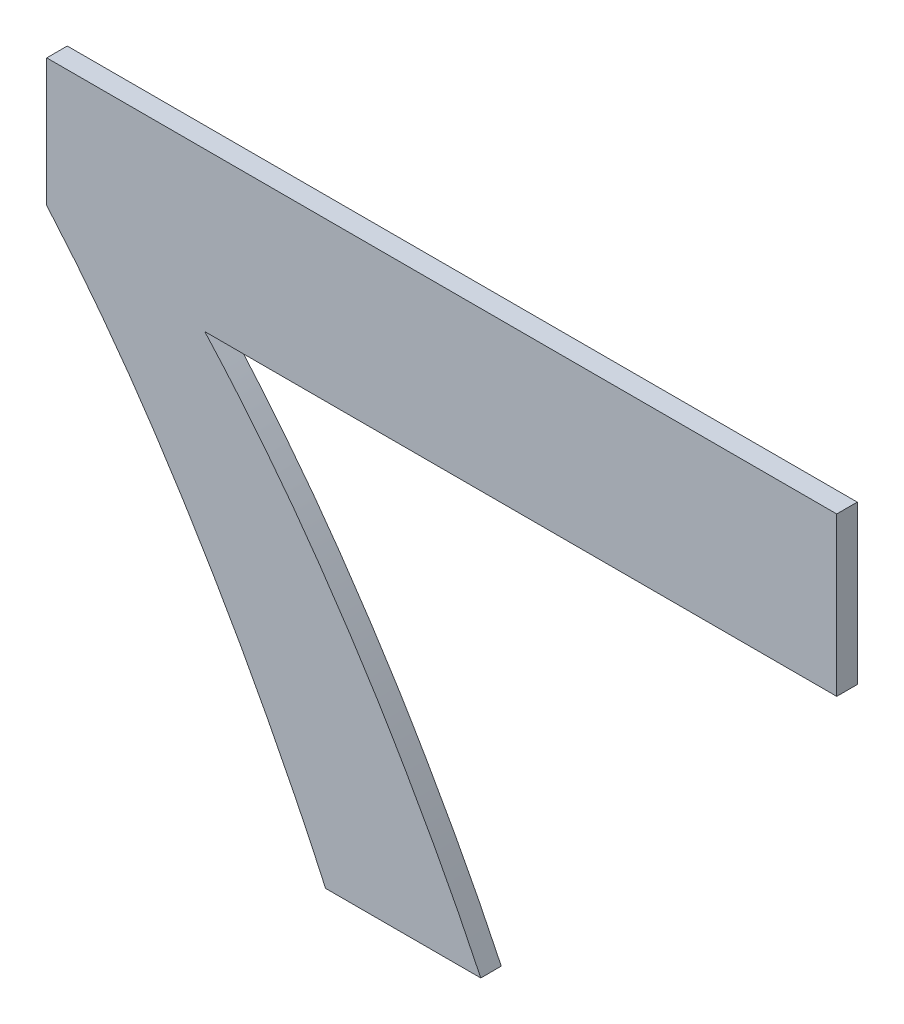
ISO-10303-21;
HEADER;
FILE_DESCRIPTION(('STEP AP214'),'2;1');
FILE_NAME('part.step','',(''),(''),'','','');
FILE_SCHEMA(('AUTOMOTIVE_DESIGN { 1 0 10303 214 1 1 1 1 }'));
ENDSEC;
DATA;
#1=APPLICATION_CONTEXT('core data for automotive mechanical design processes');
#2=APPLICATION_PROTOCOL_DEFINITION('international standard','automotive_design',2000,#1);
#3=PRODUCT_CONTEXT('',#1,'mechanical');
#4=PRODUCT('Part','Part','',(#3));
#5=PRODUCT_RELATED_PRODUCT_CATEGORY('part','',(#4));
#6=PRODUCT_DEFINITION_FORMATION('','',#4);
#7=PRODUCT_DEFINITION_CONTEXT('part definition',#1,'design');
#8=PRODUCT_DEFINITION('design','',#6,#7);
#9=PRODUCT_DEFINITION_SHAPE('','',#8);
#10=(LENGTH_UNIT() NAMED_UNIT(*) SI_UNIT(.MILLI.,.METRE.));
#11=(NAMED_UNIT(*) PLANE_ANGLE_UNIT() SI_UNIT($,.RADIAN.));
#12=(NAMED_UNIT(*) SI_UNIT($,.STERADIAN.) SOLID_ANGLE_UNIT());
#13=UNCERTAINTY_MEASURE_WITH_UNIT(LENGTH_MEASURE(1.E-05),#10,'distance_accuracy_value','');
#14=(GEOMETRIC_REPRESENTATION_CONTEXT(3) GLOBAL_UNCERTAINTY_ASSIGNED_CONTEXT((#13)) GLOBAL_UNIT_ASSIGNED_CONTEXT((#10,
#11,#12)) REPRESENTATION_CONTEXT('',''));
#15=CARTESIAN_POINT('',(0.,0.,0.));
#16=DIRECTION('',(0.,0.,1.));
#17=DIRECTION('',(1.,0.,0.));
#18=AXIS2_PLACEMENT_3D('',#15,#16,#17);
#19=CARTESIAN_POINT('',(-9.6153846153846,11.5024038461538,0.5));
#20=CARTESIAN_POINT('',(-9.3889882736424,11.2376522562014,0.5));
#21=CARTESIAN_POINT('',(-8.92608728055129,10.6963282534886,0.5));
#22=CARTESIAN_POINT('',(-8.25548066497366,9.83408603599883,0.5));
#23=CARTESIAN_POINT('',(-7.58138944532267,8.91609230107851,0.5));
#24=CARTESIAN_POINT('',(-6.9156621712902,7.93351961209931,0.5));
#25=CARTESIAN_POINT('',(-6.24835155024634,6.89353876319968,0.5));
#26=CARTESIAN_POINT('',(-5.5821432756538,5.79282828697568,0.5));
#27=CARTESIAN_POINT('',(-4.91431765251822,4.63406915861775,0.5));
#28=CARTESIAN_POINT('',(-4.03833035758797,3.01158053099116,0.5));
#29=CARTESIAN_POINT('',(-2.99323232642266,0.934386038558628,0.5));
#30=CARTESIAN_POINT('',(-1.90727624655536,-1.6250913851388,0.5));
#31=CARTESIAN_POINT('',(-0.943198230433538,-4.21007935595809,0.5));
#32=CARTESIAN_POINT('',(-0.430159665560484,-5.96811962402121,0.5));
#33=CARTESIAN_POINT('',(-0.174278846153829,-6.84495192307692,0.5));
#34=B_SPLINE_CURVE_WITH_KNOTS('',3,(#19,#20,#21,#22,#23,#24,#25,#26,#27,#28,#29,#30,#31,#32,
#33),.UNSPECIFIED.,.F.,.F.,(4,1,1,1,1,1,1,1,1,1,1,1,4),(0.,0.0502734726151882,0.102791592039982,
0.157614974931026,0.21463366483612,0.274064470748065,0.335948475214225,0.400322064136752,
0.467079328402037,0.602073356450051,0.7357483921365,0.868203050259254,1.),.UNSPECIFIED.);
#35=DIRECTION('',(0.,0.,-1.));
#36=VECTOR('',#35,1.);
#37=SURFACE_OF_LINEAR_EXTRUSION('',#34,#36);
#38=CARTESIAN_POINT('',(-9.6153846153846,11.5024038461538,0.));
#39=CARTESIAN_POINT('',(-9.3889882736424,11.2376522562014,0.));
#40=CARTESIAN_POINT('',(-8.92608728055129,10.6963282534886,0.));
#41=CARTESIAN_POINT('',(-8.25548066497366,9.83408603599883,0.));
#42=CARTESIAN_POINT('',(-7.58138944532267,8.91609230107851,0.));
#43=CARTESIAN_POINT('',(-6.9156621712902,7.93351961209931,0.));
#44=CARTESIAN_POINT('',(-6.24835155024634,6.89353876319968,0.));
#45=CARTESIAN_POINT('',(-5.5821432756538,5.79282828697568,0.));
#46=CARTESIAN_POINT('',(-4.91431765251822,4.63406915861775,0.));
#47=CARTESIAN_POINT('',(-4.03833035758797,3.01158053099116,0.));
#48=CARTESIAN_POINT('',(-2.99323232642266,0.934386038558628,0.));
#49=CARTESIAN_POINT('',(-1.90727624655536,-1.6250913851388,0.));
#50=CARTESIAN_POINT('',(-0.943198230433538,-4.21007935595809,0.));
#51=CARTESIAN_POINT('',(-0.430159665560484,-5.96811962402121,0.));
#52=CARTESIAN_POINT('',(-0.174278846153829,-6.84495192307692,0.));
#53=B_SPLINE_CURVE_WITH_KNOTS('',3,(#38,#39,#40,#41,#42,#43,#44,#45,#46,#47,#48,#49,#50,#51,
#52),.UNSPECIFIED.,.F.,.F.,(4,1,1,1,1,1,1,1,1,1,1,1,4),(0.,0.0502734726151882,0.102791592039982,
0.157614974931026,0.21463366483612,0.274064470748065,0.335948475214225,0.400322064136752,
0.467079328402037,0.602073356450051,0.7357483921365,0.868203050259254,1.),.UNSPECIFIED.);
#54=CARTESIAN_POINT('',(-9.6153846153846,11.5024038461538,0.));
#55=VERTEX_POINT('',#54);
#56=CARTESIAN_POINT('',(-2.82802602516379,0.5,0.));
#57=VERTEX_POINT('',#56);
#58=EDGE_CURVE('E132',#55,#57,#53,.T.);
#59=ORIENTED_EDGE('',*,*,#58,.T.);
#60=DIRECTION('',(0.,0.,-1.));
#61=VECTOR('',#60,1.);
#62=CARTESIAN_POINT('',(-2.82802602516379,0.499999999999999,0.5));
#63=LINE('',#62,#61);
#64=CARTESIAN_POINT('',(-2.82802602516446,0.5,0.5));
#65=VERTEX_POINT('',#64);
#66=EDGE_CURVE('E54',#57,#65,#63,.F.);
#67=ORIENTED_EDGE('',*,*,#66,.T.);
#68=CARTESIAN_POINT('',(-9.6153846153846,11.5024038461538,0.5));
#69=VERTEX_POINT('',#68);
#70=EDGE_CURVE('E128',#69,#65,#34,.T.);
#71=ORIENTED_EDGE('',*,*,#70,.F.);
#72=DIRECTION('',(0.,0.,-1.));
#73=VECTOR('',#72,1.);
#74=CARTESIAN_POINT('',(-9.6153846153846,11.5024038461538,0.5));
#75=LINE('',#74,#73);
#76=EDGE_CURVE('E133',#69,#55,#75,.T.);
#77=ORIENTED_EDGE('',*,*,#76,.T.);
#78=EDGE_LOOP('',(#59,#67,#71,#77));
#79=FACE_BOUND('',#78,.T.);
#80=ADVANCED_FACE('F39',(#79),#37,.F.);
#81=CARTESIAN_POINT('',(5.00000000000002,-15.,0.5));
#82=CARTESIAN_POINT('',(4.99077477249062,-14.7013651948623,0.5));
#83=CARTESIAN_POINT('',(4.97180363540864,-14.0872403052648,0.5));
#84=CARTESIAN_POINT('',(4.88791171104833,-13.1435720498954,0.5));
#85=CARTESIAN_POINT('',(4.77617535121427,-12.1530107653034,0.5));
#86=CARTESIAN_POINT('',(4.61835722386701,-11.1189027948977,0.5));
#87=CARTESIAN_POINT('',(4.41775741449406,-10.0391490017902,0.5));
#88=CARTESIAN_POINT('',(4.17871649303776,-8.91260570880092,0.5));
#89=CARTESIAN_POINT('',(3.89323169747081,-7.74160284995349,0.5));
#90=CARTESIAN_POINT('',(3.47101596671221,-6.11808420209938,0.5));
#91=CARTESIAN_POINT('',(2.84395697052078,-4.07664347203007,0.5));
#92=CARTESIAN_POINT('',(1.93100448110088,-1.66282701999771,0.5));
#93=CARTESIAN_POINT('',(0.881084437999897,0.709568284264685,0.5));
#94=CARTESIAN_POINT('',(-0.120982865143056,2.63345519191569,0.5));
#95=CARTESIAN_POINT('',(-0.975501110873675,4.13162478775536,0.5));
#96=CARTESIAN_POINT('',(-1.62396200729946,5.21866236523238,0.5));
#97=CARTESIAN_POINT('',(-2.29086299188346,6.25448879588679,0.5));
#98=CARTESIAN_POINT('',(-2.96384029314396,7.24655553228087,0.5));
#99=CARTESIAN_POINT('',(-3.64301055108902,8.19569803809813,0.5));
#100=CARTESIAN_POINT('',(-4.34220880125551,9.09304439301213,0.5));
#101=CARTESIAN_POINT('',(-5.04082027618084,9.95662220214234,0.5));
#102=CARTESIAN_POINT('',(-5.52856856197223,10.5007500523017,0.5));
#103=CARTESIAN_POINT('',(-5.76923076923075,10.7692307692308,0.5));
#104=B_SPLINE_CURVE_WITH_KNOTS('',3,(#81,#82,#83,#84,#85,#86,#87,#88,#89,#90,#91,#92,#93,#94,
#95,#96,#97,#98,#99,#100,#101,#102,#103),.UNSPECIFIED.,.F.,.F.,(4,1,1,1,1,1,1,1,1,1,1,1,1,1,1,1,
1,1,1,1,4),(0.,0.0315156437386742,0.0648100653327354,0.0999121128959951,0.136676095020003,
0.175144023715208,0.215765905895984,0.2581579823942,0.30229429684818,0.392742479500207,
0.483300472378782,0.574413865251515,0.666292469849835,0.712009554638809,0.756373487942463,
0.799814650688496,0.841961044395734,0.882842690062067,0.922917712140965,0.961966460821911,1.),.UNSPECIFIED.);
#105=DIRECTION('',(0.,0.,-1.));
#106=VECTOR('',#105,1.);
#107=SURFACE_OF_LINEAR_EXTRUSION('',#104,#106);
#108=CARTESIAN_POINT('',(0.950680533351782,0.499999990300443,0.5));
#109=VERTEX_POINT('',#108);
#110=CARTESIAN_POINT('',(-5.76923076923075,10.7692307692308,0.5));
#111=VERTEX_POINT('',#110);
#112=EDGE_CURVE('E131',#109,#111,#104,.T.);
#113=ORIENTED_EDGE('',*,*,#112,.F.);
#114=DIRECTION('',(0.,0.,-1.));
#115=VECTOR('',#114,1.);
#116=CARTESIAN_POINT('',(0.950680528748145,0.500000000000002,0.5));
#117=LINE('',#116,#115);
#118=CARTESIAN_POINT('',(0.949733198286479,0.5,-1.2E-05));
#119=VERTEX_POINT('',#118);
#120=EDGE_CURVE('E140',#109,#119,#117,.T.);
#121=ORIENTED_EDGE('',*,*,#120,.T.);
#122=CARTESIAN_POINT('',(5.00000000000002,-15.,0.));
#123=CARTESIAN_POINT('',(4.99077477249062,-14.7013651948623,0.));
#124=CARTESIAN_POINT('',(4.97180363540864,-14.0872403052648,0.));
#125=CARTESIAN_POINT('',(4.88791171104833,-13.1435720498954,0.));
#126=CARTESIAN_POINT('',(4.77617535121427,-12.1530107653034,0.));
#127=CARTESIAN_POINT('',(4.61835722386701,-11.1189027948977,0.));
#128=CARTESIAN_POINT('',(4.41775741449406,-10.0391490017902,0.));
#129=CARTESIAN_POINT('',(4.17871649303776,-8.91260570880092,0.));
#130=CARTESIAN_POINT('',(3.89323169747081,-7.74160284995349,0.));
#131=CARTESIAN_POINT('',(3.47101596671221,-6.11808420209938,0.));
#132=CARTESIAN_POINT('',(2.84395697052078,-4.07664347203007,0.));
#133=CARTESIAN_POINT('',(1.93100448110088,-1.66282701999771,0.));
#134=CARTESIAN_POINT('',(0.881084437999897,0.709568284264685,0.));
#135=CARTESIAN_POINT('',(-0.120982865143056,2.63345519191569,0.));
#136=CARTESIAN_POINT('',(-0.975501110873675,4.13162478775536,0.));
#137=CARTESIAN_POINT('',(-1.62396200729946,5.21866236523238,0.));
#138=CARTESIAN_POINT('',(-2.29086299188346,6.25448879588679,0.));
#139=CARTESIAN_POINT('',(-2.96384029314396,7.24655553228087,0.));
#140=CARTESIAN_POINT('',(-3.64301055108902,8.19569803809813,0.));
#141=CARTESIAN_POINT('',(-4.34220880125551,9.09304439301213,0.));
#142=CARTESIAN_POINT('',(-5.04082027618084,9.95662220214234,0.));
#143=CARTESIAN_POINT('',(-5.52856856197223,10.5007500523017,0.));
#144=CARTESIAN_POINT('',(-5.76923076923075,10.7692307692308,0.));
#145=B_SPLINE_CURVE_WITH_KNOTS('',3,(#122,#123,#124,#125,#126,#127,#128,#129,#130,#131,#132,
#133,#134,#135,#136,#137,#138,#139,#140,#141,#142,#143,#144),.UNSPECIFIED.,.F.,.F.,(4,1,1,1,1,1,
1,1,1,1,1,1,1,1,1,1,1,1,1,1,4),(0.,0.0315156437386742,0.0648100653327354,0.0999121128959951,
0.136676095020003,0.175144023715208,0.215765905895984,0.2581579823942,0.30229429684818,
0.392742479500207,0.483300472378782,0.574413865251515,0.666292469849835,0.712009554638809,
0.756373487942463,0.799814650688496,0.841961044395734,0.882842690062067,0.922917712140965,
0.961966460821911,1.),.UNSPECIFIED.);
#146=CARTESIAN_POINT('',(-5.76923076923075,10.7692307692308,0.));
#147=VERTEX_POINT('',#146);
#148=EDGE_CURVE('E138',#119,#147,#145,.T.);
#149=ORIENTED_EDGE('',*,*,#148,.T.);
#150=DIRECTION('',(0.,0.,-1.));
#151=VECTOR('',#150,1.);
#152=CARTESIAN_POINT('',(-5.76923076923075,10.7692307692308,0.5));
#153=LINE('',#152,#151);
#154=EDGE_CURVE('E181',#111,#147,#153,.T.);
#155=ORIENTED_EDGE('',*,*,#154,.F.);
#156=EDGE_LOOP('',(#113,#121,#149,#155));
#157=FACE_BOUND('',#156,.T.);
#158=ADVANCED_FACE('F154',(#157),#107,.F.);
#159=CARTESIAN_POINT('',(-3.95049273409952,2.81861389838005,0.5));
#160=DIRECTION('',(0.,0.,1.));
#161=DIRECTION('',(1.,0.,0.));
#162=AXIS2_PLACEMENT_3D('',#159,#160,#161);
#163=PLANE('',#162);
#164=DIRECTION('',(-1.,0.,0.));
#165=VECTOR('',#164,1.);
#166=CARTESIAN_POINT('',(-3.95049273409952,0.5,0.5));
#167=LINE('',#166,#165);
#168=EDGE_CURVE('E11',#109,#65,#167,.T.);
#169=ORIENTED_EDGE('',*,*,#168,.F.);
#170=ORIENTED_EDGE('',*,*,#112,.T.);
#171=DIRECTION('',(1.,0.,0.));
#172=VECTOR('',#171,1.);
#173=CARTESIAN_POINT('',(-5.76923076923075,10.7692307692308,0.5));
#174=LINE('',#173,#172);
#175=CARTESIAN_POINT('',(9.61538461538463,10.7692307692308,0.5));
#176=VERTEX_POINT('',#175);
#177=EDGE_CURVE('E110',#111,#176,#174,.T.);
#178=ORIENTED_EDGE('',*,*,#177,.T.);
#179=DIRECTION('',(0.,1.,0.));
#180=VECTOR('',#179,1.);
#181=CARTESIAN_POINT('',(9.61538461538463,10.7692307692308,0.5));
#182=LINE('',#181,#180);
#183=CARTESIAN_POINT('',(9.61538461538463,14.6153846153846,0.5));
#184=VERTEX_POINT('',#183);
#185=EDGE_CURVE('E102',#176,#184,#182,.T.);
#186=ORIENTED_EDGE('',*,*,#185,.T.);
#187=DIRECTION('',(-1.,0.,0.));
#188=VECTOR('',#187,1.);
#189=CARTESIAN_POINT('',(9.61538461538463,14.6153846153846,0.5));
#190=LINE('',#189,#188);
#191=CARTESIAN_POINT('',(-9.6153846153846,14.6153846153846,0.5));
#192=VERTEX_POINT('',#191);
#193=EDGE_CURVE('E103',#184,#192,#190,.T.);
#194=ORIENTED_EDGE('',*,*,#193,.T.);
#195=DIRECTION('',(0.,-1.,0.));
#196=VECTOR('',#195,1.);
#197=CARTESIAN_POINT('',(-9.6153846153846,14.6153846153846,0.5));
#198=LINE('',#197,#196);
#199=EDGE_CURVE('E125',#192,#69,#198,.T.);
#200=ORIENTED_EDGE('',*,*,#199,.T.);
#201=ORIENTED_EDGE('',*,*,#70,.T.);
#202=EDGE_LOOP('',(#169,#170,#178,#186,#194,#200,#201));
#203=FACE_BOUND('',#202,.T.);
#204=ADVANCED_FACE('F104',(#203),#163,.T.);
#205=CARTESIAN_POINT('',(-3.95049273409952,2.81861389838005,0.));
#206=DIRECTION('',(0.,0.,1.));
#207=DIRECTION('',(1.,0.,0.));
#208=AXIS2_PLACEMENT_3D('',#205,#206,#207);
#209=PLANE('',#208);
#210=DIRECTION('',(1.,0.,0.));
#211=VECTOR('',#210,1.);
#212=CARTESIAN_POINT('',(-17.,0.5,0.));
#213=LINE('',#212,#211);
#214=EDGE_CURVE('E48',#57,#119,#213,.T.);
#215=ORIENTED_EDGE('',*,*,#214,.F.);
#216=ORIENTED_EDGE('',*,*,#58,.F.);
#217=DIRECTION('',(0.,-1.,0.));
#218=VECTOR('',#217,1.);
#219=CARTESIAN_POINT('',(-9.6153846153846,14.6153846153846,0.));
#220=LINE('',#219,#218);
#221=CARTESIAN_POINT('',(-9.6153846153846,14.6153846153846,0.));
#222=VERTEX_POINT('',#221);
#223=EDGE_CURVE('E73',#222,#55,#220,.T.);
#224=ORIENTED_EDGE('',*,*,#223,.F.);
#225=DIRECTION('',(-1.,0.,0.));
#226=VECTOR('',#225,1.);
#227=CARTESIAN_POINT('',(9.61538461538463,14.6153846153846,0.));
#228=LINE('',#227,#226);
#229=CARTESIAN_POINT('',(9.61538461538463,14.6153846153846,0.));
#230=VERTEX_POINT('',#229);
#231=EDGE_CURVE('E116',#230,#222,#228,.T.);
#232=ORIENTED_EDGE('',*,*,#231,.F.);
#233=DIRECTION('',(0.,1.,0.));
#234=VECTOR('',#233,1.);
#235=CARTESIAN_POINT('',(9.61538461538463,10.7692307692308,0.));
#236=LINE('',#235,#234);
#237=CARTESIAN_POINT('',(9.61538461538463,10.7692307692308,0.));
#238=VERTEX_POINT('',#237);
#239=EDGE_CURVE('E117',#238,#230,#236,.T.);
#240=ORIENTED_EDGE('',*,*,#239,.F.);
#241=DIRECTION('',(1.,0.,0.));
#242=VECTOR('',#241,1.);
#243=CARTESIAN_POINT('',(-5.76923076923075,10.7692307692308,0.));
#244=LINE('',#243,#242);
#245=EDGE_CURVE('E183',#147,#238,#244,.T.);
#246=ORIENTED_EDGE('',*,*,#245,.F.);
#247=ORIENTED_EDGE('',*,*,#148,.F.);
#248=EDGE_LOOP('',(#215,#216,#224,#232,#240,#246,#247));
#249=FACE_BOUND('',#248,.T.);
#250=ADVANCED_FACE('F41',(#249),#209,.F.);
#251=CARTESIAN_POINT('',(-5.76923076923075,10.7692307692308,0.5));
#252=DIRECTION('',(0.,1.,0.));
#253=DIRECTION('',(0.,0.,1.));
#254=AXIS2_PLACEMENT_3D('',#251,#252,#253);
#255=PLANE('',#254);
#256=ORIENTED_EDGE('',*,*,#245,.T.);
#257=DIRECTION('',(0.,0.,-1.));
#258=VECTOR('',#257,1.);
#259=CARTESIAN_POINT('',(9.61538461538463,10.7692307692308,0.5));
#260=LINE('',#259,#258);
#261=EDGE_CURVE('E186',#176,#238,#260,.T.);
#262=ORIENTED_EDGE('',*,*,#261,.F.);
#263=ORIENTED_EDGE('',*,*,#177,.F.);
#264=ORIENTED_EDGE('',*,*,#154,.T.);
#265=EDGE_LOOP('',(#256,#262,#263,#264));
#266=FACE_BOUND('',#265,.T.);
#267=ADVANCED_FACE('F204',(#266),#255,.F.);
#268=CARTESIAN_POINT('',(9.61538461538463,10.7692307692308,0.5));
#269=DIRECTION('',(-1.,0.,0.));
#270=DIRECTION('',(0.,0.,1.));
#271=AXIS2_PLACEMENT_3D('',#268,#269,#270);
#272=PLANE('',#271);
#273=ORIENTED_EDGE('',*,*,#239,.T.);
#274=DIRECTION('',(0.,0.,-1.));
#275=VECTOR('',#274,1.);
#276=CARTESIAN_POINT('',(9.61538461538463,14.6153846153846,0.5));
#277=LINE('',#276,#275);
#278=EDGE_CURVE('E114',#184,#230,#277,.T.);
#279=ORIENTED_EDGE('',*,*,#278,.F.);
#280=ORIENTED_EDGE('',*,*,#185,.F.);
#281=ORIENTED_EDGE('',*,*,#261,.T.);
#282=EDGE_LOOP('',(#273,#279,#280,#281));
#283=FACE_BOUND('',#282,.T.);
#284=ADVANCED_FACE('F113',(#283),#272,.F.);
#285=CARTESIAN_POINT('',(9.61538461538463,14.6153846153846,0.5));
#286=DIRECTION('',(0.,-1.,0.));
#287=DIRECTION('',(0.,0.,-1.));
#288=AXIS2_PLACEMENT_3D('',#285,#286,#287);
#289=PLANE('',#288);
#290=ORIENTED_EDGE('',*,*,#231,.T.);
#291=DIRECTION('',(0.,0.,-1.));
#292=VECTOR('',#291,1.);
#293=CARTESIAN_POINT('',(-9.6153846153846,14.6153846153846,0.5));
#294=LINE('',#293,#292);
#295=EDGE_CURVE('E122',#192,#222,#294,.T.);
#296=ORIENTED_EDGE('',*,*,#295,.F.);
#297=ORIENTED_EDGE('',*,*,#193,.F.);
#298=ORIENTED_EDGE('',*,*,#278,.T.);
#299=EDGE_LOOP('',(#290,#296,#297,#298));
#300=FACE_BOUND('',#299,.T.);
#301=ADVANCED_FACE('F123',(#300),#289,.F.);
#302=CARTESIAN_POINT('',(-9.6153846153846,14.6153846153846,0.5));
#303=DIRECTION('',(1.,0.,0.));
#304=DIRECTION('',(0.,0.,-1.));
#305=AXIS2_PLACEMENT_3D('',#302,#303,#304);
#306=PLANE('',#305);
#307=ORIENTED_EDGE('',*,*,#223,.T.);
#308=ORIENTED_EDGE('',*,*,#76,.F.);
#309=ORIENTED_EDGE('',*,*,#199,.F.);
#310=ORIENTED_EDGE('',*,*,#295,.T.);
#311=EDGE_LOOP('',(#307,#308,#309,#310));
#312=FACE_BOUND('',#311,.T.);
#313=ADVANCED_FACE('F192',(#312),#306,.F.);
#314=CARTESIAN_POINT('',(-17.,0.5,1.));
#315=DIRECTION('',(0.,1.,0.));
#316=DIRECTION('',(0.,0.,1.));
#317=AXIS2_PLACEMENT_3D('',#314,#315,#316);
#318=PLANE('',#317);
#319=ORIENTED_EDGE('',*,*,#214,.T.);
#320=ORIENTED_EDGE('',*,*,#120,.F.);
#321=ORIENTED_EDGE('',*,*,#168,.T.);
#322=ORIENTED_EDGE('',*,*,#66,.F.);
#323=EDGE_LOOP('',(#319,#320,#321,#322));
#324=FACE_BOUND('',#323,.T.);
#325=ADVANCED_FACE('F194',(#324),#318,.F.);
#326=CLOSED_SHELL('',(#80,#158,#204,#250,#267,#284,#301,#313,#325));
#327=MANIFOLD_SOLID_BREP('B2',#326);
#328=ADVANCED_BREP_SHAPE_REPRESENTATION('',(#18,#327),#14);
#329=SHAPE_DEFINITION_REPRESENTATION(#9,#328);
ENDSEC;
END-ISO-10303-21;
